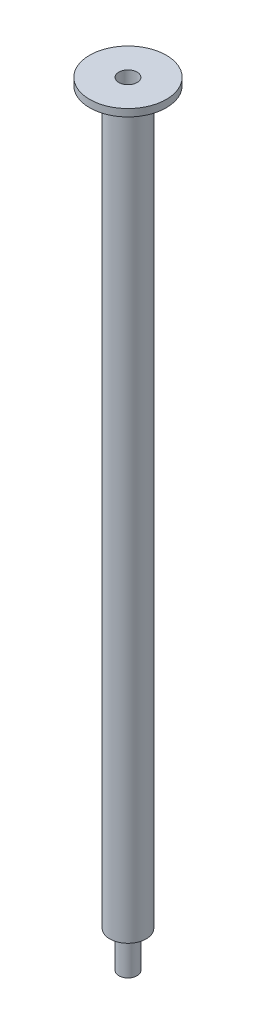
ISO-10303-21;
HEADER;
FILE_DESCRIPTION(('STEP AP214'),'2;1');
FILE_NAME('part.step','',(''),(''),'','','');
FILE_SCHEMA(('AUTOMOTIVE_DESIGN { 1 0 10303 214 1 1 1 1 }'));
ENDSEC;
DATA;
#1=APPLICATION_CONTEXT('core data for automotive mechanical design processes');
#2=APPLICATION_PROTOCOL_DEFINITION('international standard','automotive_design',2000,#1);
#3=PRODUCT_CONTEXT('',#1,'mechanical');
#4=PRODUCT('Part','Part','',(#3));
#5=PRODUCT_RELATED_PRODUCT_CATEGORY('part','',(#4));
#6=PRODUCT_DEFINITION_FORMATION('','',#4);
#7=PRODUCT_DEFINITION_CONTEXT('part definition',#1,'design');
#8=PRODUCT_DEFINITION('design','',#6,#7);
#9=PRODUCT_DEFINITION_SHAPE('','',#8);
#10=(LENGTH_UNIT() NAMED_UNIT(*) SI_UNIT(.MILLI.,.METRE.));
#11=(NAMED_UNIT(*) PLANE_ANGLE_UNIT() SI_UNIT($,.RADIAN.));
#12=(NAMED_UNIT(*) SI_UNIT($,.STERADIAN.) SOLID_ANGLE_UNIT());
#13=UNCERTAINTY_MEASURE_WITH_UNIT(LENGTH_MEASURE(1.E-05),#10,'distance_accuracy_value','');
#14=(GEOMETRIC_REPRESENTATION_CONTEXT(3) GLOBAL_UNCERTAINTY_ASSIGNED_CONTEXT((#13)) GLOBAL_UNIT_ASSIGNED_CONTEXT((#10,
#11,#12)) REPRESENTATION_CONTEXT('',''));
#15=CARTESIAN_POINT('',(0.,0.,0.));
#16=DIRECTION('',(0.,0.,1.));
#17=DIRECTION('',(1.,0.,0.));
#18=AXIS2_PLACEMENT_3D('',#15,#16,#17);
#19=CARTESIAN_POINT('',(0.,200.,0.));
#20=DIRECTION('',(0.,-1.,0.));
#21=DIRECTION('',(0.,0.,-1.));
#22=AXIS2_PLACEMENT_3D('',#19,#20,#21);
#23=CYLINDRICAL_SURFACE('',#22,5.);
#24=CARTESIAN_POINT('',(0.,200.,0.));
#25=DIRECTION('',(0.,1.,0.));
#26=DIRECTION('',(0.,0.,1.));
#27=AXIS2_PLACEMENT_3D('',#24,#25,#26);
#28=CIRCLE('',#27,5.);
#29=CARTESIAN_POINT('',(0.,200.,5.));
#30=VERTEX_POINT('',#29);
#31=EDGE_CURVE('E57',#30,#30,#28,.T.);
#32=ORIENTED_EDGE('',*,*,#31,.F.);
#33=EDGE_LOOP('',(#32));
#34=FACE_BOUND('',#33,.T.);
#35=CARTESIAN_POINT('',(0.,0.,0.));
#36=DIRECTION('',(0.,1.,0.));
#37=DIRECTION('',(0.,0.,1.));
#38=AXIS2_PLACEMENT_3D('',#35,#36,#37);
#39=CIRCLE('',#38,5.);
#40=CARTESIAN_POINT('',(0.,0.,5.));
#41=VERTEX_POINT('',#40);
#42=EDGE_CURVE('E52',#41,#41,#39,.T.);
#43=ORIENTED_EDGE('',*,*,#42,.T.);
#44=EDGE_LOOP('',(#43));
#45=FACE_BOUND('',#44,.T.);
#46=ADVANCED_FACE('F49',(#34,#45),#23,.T.);
#47=CARTESIAN_POINT('',(0.,0.,0.));
#48=DIRECTION('',(0.,1.,0.));
#49=DIRECTION('',(0.,0.,1.));
#50=AXIS2_PLACEMENT_3D('',#47,#48,#49);
#51=PLANE('',#50);
#52=CARTESIAN_POINT('',(0.,0.,0.));
#53=DIRECTION('',(0.,-1.,0.));
#54=DIRECTION('',(0.,0.,-1.));
#55=AXIS2_PLACEMENT_3D('',#52,#53,#54);
#56=CIRCLE('',#55,2.5);
#57=CARTESIAN_POINT('',(0.,0.,-2.5));
#58=VERTEX_POINT('',#57);
#59=EDGE_CURVE('E12',#58,#58,#56,.T.);
#60=ORIENTED_EDGE('',*,*,#59,.F.);
#61=EDGE_LOOP('',(#60));
#62=FACE_BOUND('',#61,.T.);
#63=ORIENTED_EDGE('',*,*,#42,.F.);
#64=EDGE_LOOP('',(#63));
#65=FACE_BOUND('',#64,.T.);
#66=ADVANCED_FACE('F102',(#62,#65),#51,.F.);
#67=CARTESIAN_POINT('',(0.,202.,0.));
#68=DIRECTION('',(0.,-1.,0.));
#69=DIRECTION('',(0.,0.,-1.));
#70=AXIS2_PLACEMENT_3D('',#67,#68,#69);
#71=CYLINDRICAL_SURFACE('',#70,10.5);
#72=CARTESIAN_POINT('',(0.,202.,0.));
#73=DIRECTION('',(0.,1.,0.));
#74=DIRECTION('',(0.,0.,1.));
#75=AXIS2_PLACEMENT_3D('',#72,#73,#74);
#76=CIRCLE('',#75,10.5);
#77=CARTESIAN_POINT('',(0.,202.,10.5));
#78=VERTEX_POINT('',#77);
#79=EDGE_CURVE('E75',#78,#78,#76,.T.);
#80=ORIENTED_EDGE('',*,*,#79,.F.);
#81=EDGE_LOOP('',(#80));
#82=FACE_BOUND('',#81,.T.);
#83=CARTESIAN_POINT('',(0.,200.,0.));
#84=DIRECTION('',(0.,1.,0.));
#85=DIRECTION('',(0.,0.,1.));
#86=AXIS2_PLACEMENT_3D('',#83,#84,#85);
#87=CIRCLE('',#86,10.5);
#88=CARTESIAN_POINT('',(0.,200.,10.5));
#89=VERTEX_POINT('',#88);
#90=EDGE_CURVE('E70',#89,#89,#87,.T.);
#91=ORIENTED_EDGE('',*,*,#90,.T.);
#92=EDGE_LOOP('',(#91));
#93=FACE_BOUND('',#92,.T.);
#94=ADVANCED_FACE('F83',(#82,#93),#71,.T.);
#95=CARTESIAN_POINT('',(0.,202.,0.));
#96=DIRECTION('',(0.,1.,0.));
#97=DIRECTION('',(0.,0.,1.));
#98=AXIS2_PLACEMENT_3D('',#95,#96,#97);
#99=PLANE('',#98);
#100=CARTESIAN_POINT('',(0.,202.,0.));
#101=DIRECTION('',(0.,1.,0.));
#102=DIRECTION('',(0.,0.,1.));
#103=AXIS2_PLACEMENT_3D('',#100,#101,#102);
#104=CIRCLE('',#103,2.5);
#105=CARTESIAN_POINT('',(0.,202.,2.5));
#106=VERTEX_POINT('',#105);
#107=EDGE_CURVE('E71',#106,#106,#104,.T.);
#108=ORIENTED_EDGE('',*,*,#107,.F.);
#109=EDGE_LOOP('',(#108));
#110=FACE_BOUND('',#109,.T.);
#111=ORIENTED_EDGE('',*,*,#79,.T.);
#112=EDGE_LOOP('',(#111));
#113=FACE_BOUND('',#112,.T.);
#114=ADVANCED_FACE('F88',(#110,#113),#99,.T.);
#115=CARTESIAN_POINT('',(0.,200.,0.));
#116=DIRECTION('',(0.,1.,0.));
#117=DIRECTION('',(0.,0.,1.));
#118=AXIS2_PLACEMENT_3D('',#115,#116,#117);
#119=PLANE('',#118);
#120=ORIENTED_EDGE('',*,*,#31,.T.);
#121=EDGE_LOOP('',(#120));
#122=FACE_BOUND('',#121,.T.);
#123=ORIENTED_EDGE('',*,*,#90,.F.);
#124=EDGE_LOOP('',(#123));
#125=FACE_BOUND('',#124,.T.);
#126=ADVANCED_FACE('F85',(#122,#125),#119,.F.);
#127=CARTESIAN_POINT('',(0.,192.,0.));
#128=DIRECTION('',(0.,1.,0.));
#129=DIRECTION('',(0.,0.,1.));
#130=AXIS2_PLACEMENT_3D('',#127,#128,#129);
#131=CYLINDRICAL_SURFACE('',#130,2.5);
#132=CARTESIAN_POINT('',(0.,192.,0.));
#133=DIRECTION('',(0.,1.,0.));
#134=DIRECTION('',(0.,0.,1.));
#135=AXIS2_PLACEMENT_3D('',#132,#133,#134);
#136=CIRCLE('',#135,2.5);
#137=CARTESIAN_POINT('',(0.,192.,2.5));
#138=VERTEX_POINT('',#137);
#139=EDGE_CURVE('E66',#138,#138,#136,.T.);
#140=ORIENTED_EDGE('',*,*,#139,.F.);
#141=EDGE_LOOP('',(#140));
#142=FACE_BOUND('',#141,.T.);
#143=ORIENTED_EDGE('',*,*,#107,.T.);
#144=EDGE_LOOP('',(#143));
#145=FACE_BOUND('',#144,.T.);
#146=ADVANCED_FACE('F87',(#142,#145),#131,.F.);
#147=CARTESIAN_POINT('',(0.,192.,0.));
#148=DIRECTION('',(0.,1.,0.));
#149=DIRECTION('',(0.,0.,1.));
#150=AXIS2_PLACEMENT_3D('',#147,#148,#149);
#151=PLANE('',#150);
#152=ORIENTED_EDGE('',*,*,#139,.T.);
#153=EDGE_LOOP('',(#152));
#154=FACE_BOUND('',#153,.T.);
#155=ADVANCED_FACE('F95',(#154),#151,.T.);
#156=CARTESIAN_POINT('',(0.,-10.,0.));
#157=DIRECTION('',(0.,1.,0.));
#158=DIRECTION('',(0.,0.,1.));
#159=AXIS2_PLACEMENT_3D('',#156,#157,#158);
#160=CYLINDRICAL_SURFACE('',#159,2.5);
#161=CARTESIAN_POINT('',(0.,-10.,0.));
#162=DIRECTION('',(0.,-1.,0.));
#163=DIRECTION('',(0.,0.,-1.));
#164=AXIS2_PLACEMENT_3D('',#161,#162,#163);
#165=CIRCLE('',#164,2.5);
#166=CARTESIAN_POINT('',(0.,-10.,-2.5));
#167=VERTEX_POINT('',#166);
#168=EDGE_CURVE('E65',#167,#167,#165,.T.);
#169=ORIENTED_EDGE('',*,*,#168,.F.);
#170=EDGE_LOOP('',(#169));
#171=FACE_BOUND('',#170,.T.);
#172=ORIENTED_EDGE('',*,*,#59,.T.);
#173=EDGE_LOOP('',(#172));
#174=FACE_BOUND('',#173,.T.);
#175=ADVANCED_FACE('F142',(#171,#174),#160,.T.);
#176=CARTESIAN_POINT('',(0.,-10.,0.));
#177=DIRECTION('',(0.,-1.,0.));
#178=DIRECTION('',(0.,0.,-1.));
#179=AXIS2_PLACEMENT_3D('',#176,#177,#178);
#180=PLANE('',#179);
#181=ORIENTED_EDGE('',*,*,#168,.T.);
#182=EDGE_LOOP('',(#181));
#183=FACE_BOUND('',#182,.T.);
#184=ADVANCED_FACE('F158',(#183),#180,.T.);
#185=CLOSED_SHELL('',(#46,#66,#94,#114,#126,#146,#155,#175,#184));
#186=MANIFOLD_SOLID_BREP('B2',#185);
#187=ADVANCED_BREP_SHAPE_REPRESENTATION('',(#18,#186),#14);
#188=SHAPE_DEFINITION_REPRESENTATION(#9,#187);
ENDSEC;
END-ISO-10303-21;
